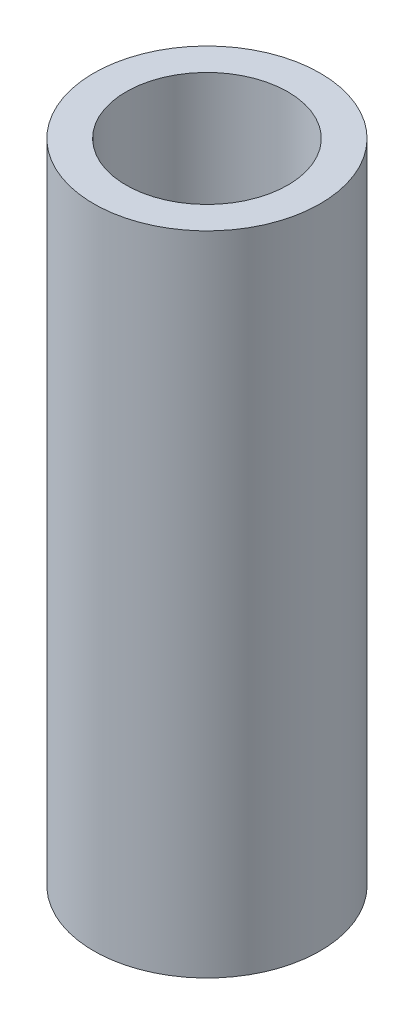
ISO-10303-21;
HEADER;
FILE_DESCRIPTION(('STEP AP214'),'2;1');
FILE_NAME('part.step','',(''),(''),'','','');
FILE_SCHEMA(('AUTOMOTIVE_DESIGN { 1 0 10303 214 1 1 1 1 }'));
ENDSEC;
DATA;
#1=APPLICATION_CONTEXT('core data for automotive mechanical design processes');
#2=APPLICATION_PROTOCOL_DEFINITION('international standard','automotive_design',2000,#1);
#3=PRODUCT_CONTEXT('',#1,'mechanical');
#4=PRODUCT('Part','Part','',(#3));
#5=PRODUCT_RELATED_PRODUCT_CATEGORY('part','',(#4));
#6=PRODUCT_DEFINITION_FORMATION('','',#4);
#7=PRODUCT_DEFINITION_CONTEXT('part definition',#1,'design');
#8=PRODUCT_DEFINITION('design','',#6,#7);
#9=PRODUCT_DEFINITION_SHAPE('','',#8);
#10=(LENGTH_UNIT() NAMED_UNIT(*) SI_UNIT(.MILLI.,.METRE.));
#11=(NAMED_UNIT(*) PLANE_ANGLE_UNIT() SI_UNIT($,.RADIAN.));
#12=(NAMED_UNIT(*) SI_UNIT($,.STERADIAN.) SOLID_ANGLE_UNIT());
#13=UNCERTAINTY_MEASURE_WITH_UNIT(LENGTH_MEASURE(1.E-05),#10,'distance_accuracy_value','');
#14=(GEOMETRIC_REPRESENTATION_CONTEXT(3) GLOBAL_UNCERTAINTY_ASSIGNED_CONTEXT((#13)) GLOBAL_UNIT_ASSIGNED_CONTEXT((#10,
#11,#12)) REPRESENTATION_CONTEXT('',''));
#15=CARTESIAN_POINT('',(0.,0.,0.));
#16=DIRECTION('',(0.,0.,1.));
#17=DIRECTION('',(1.,0.,0.));
#18=AXIS2_PLACEMENT_3D('',#15,#16,#17);
#19=CARTESIAN_POINT('',(0.,0.,0.));
#20=DIRECTION('',(0.,-1.,0.));
#21=DIRECTION('',(0.,0.,-1.));
#22=AXIS2_PLACEMENT_3D('',#19,#20,#21);
#23=CYLINDRICAL_SURFACE('',#22,3.175);
#24=CARTESIAN_POINT('',(0.,0.,0.));
#25=DIRECTION('',(0.,-1.,0.));
#26=DIRECTION('',(0.,0.,-1.));
#27=AXIS2_PLACEMENT_3D('',#24,#25,#26);
#28=CIRCLE('',#27,3.175);
#29=CARTESIAN_POINT('',(0.,0.,-3.175));
#30=VERTEX_POINT('',#29);
#31=EDGE_CURVE('E54',#30,#30,#28,.T.);
#32=ORIENTED_EDGE('',*,*,#31,.T.);
#33=EDGE_LOOP('',(#32));
#34=FACE_BOUND('',#33,.T.);
#35=CARTESIAN_POINT('',(0.,25.4,0.));
#36=DIRECTION('',(0.,-1.,0.));
#37=DIRECTION('',(0.,0.,-1.));
#38=AXIS2_PLACEMENT_3D('',#35,#36,#37);
#39=CIRCLE('',#38,3.175);
#40=CARTESIAN_POINT('',(0.,25.4,-3.175));
#41=VERTEX_POINT('',#40);
#42=EDGE_CURVE('E10',#41,#41,#39,.T.);
#43=ORIENTED_EDGE('',*,*,#42,.F.);
#44=EDGE_LOOP('',(#43));
#45=FACE_BOUND('',#44,.T.);
#46=ADVANCED_FACE('F37',(#34,#45),#23,.F.);
#47=CARTESIAN_POINT('',(3.175,25.4,0.));
#48=DIRECTION('',(0.,1.,0.));
#49=DIRECTION('',(0.,0.,1.));
#50=AXIS2_PLACEMENT_3D('',#47,#48,#49);
#51=PLANE('',#50);
#52=ORIENTED_EDGE('',*,*,#42,.T.);
#53=EDGE_LOOP('',(#52));
#54=FACE_BOUND('',#53,.T.);
#55=CARTESIAN_POINT('',(0.,25.4,0.));
#56=DIRECTION('',(0.,-1.,0.));
#57=DIRECTION('',(0.,0.,-1.));
#58=AXIS2_PLACEMENT_3D('',#55,#56,#57);
#59=CIRCLE('',#58,4.445);
#60=CARTESIAN_POINT('',(0.,25.4,-4.445));
#61=VERTEX_POINT('',#60);
#62=EDGE_CURVE('E44',#61,#61,#59,.T.);
#63=ORIENTED_EDGE('',*,*,#62,.F.);
#64=EDGE_LOOP('',(#63));
#65=FACE_BOUND('',#64,.T.);
#66=ADVANCED_FACE('F71',(#54,#65),#51,.T.);
#67=CARTESIAN_POINT('',(0.,0.,0.));
#68=DIRECTION('',(0.,-1.,0.));
#69=DIRECTION('',(0.,0.,-1.));
#70=AXIS2_PLACEMENT_3D('',#67,#68,#69);
#71=CYLINDRICAL_SURFACE('',#70,4.445);
#72=ORIENTED_EDGE('',*,*,#62,.T.);
#73=EDGE_LOOP('',(#72));
#74=FACE_BOUND('',#73,.T.);
#75=CARTESIAN_POINT('',(0.,0.,0.));
#76=DIRECTION('',(0.,-1.,0.));
#77=DIRECTION('',(0.,0.,-1.));
#78=AXIS2_PLACEMENT_3D('',#75,#76,#77);
#79=CIRCLE('',#78,4.445);
#80=CARTESIAN_POINT('',(0.,0.,-4.445));
#81=VERTEX_POINT('',#80);
#82=EDGE_CURVE('E49',#81,#81,#79,.T.);
#83=ORIENTED_EDGE('',*,*,#82,.F.);
#84=EDGE_LOOP('',(#83));
#85=FACE_BOUND('',#84,.T.);
#86=ADVANCED_FACE('F65',(#74,#85),#71,.T.);
#87=CARTESIAN_POINT('',(3.175,0.,0.));
#88=DIRECTION('',(0.,-1.,0.));
#89=DIRECTION('',(0.,0.,-1.));
#90=AXIS2_PLACEMENT_3D('',#87,#88,#89);
#91=PLANE('',#90);
#92=ORIENTED_EDGE('',*,*,#82,.T.);
#93=EDGE_LOOP('',(#92));
#94=FACE_BOUND('',#93,.T.);
#95=ORIENTED_EDGE('',*,*,#31,.F.);
#96=EDGE_LOOP('',(#95));
#97=FACE_BOUND('',#96,.T.);
#98=ADVANCED_FACE('F63',(#94,#97),#91,.T.);
#99=CLOSED_SHELL('',(#46,#66,#86,#98));
#100=MANIFOLD_SOLID_BREP('B2',#99);
#101=ADVANCED_BREP_SHAPE_REPRESENTATION('',(#18,#100),#14);
#102=SHAPE_DEFINITION_REPRESENTATION(#9,#101);
ENDSEC;
END-ISO-10303-21;
